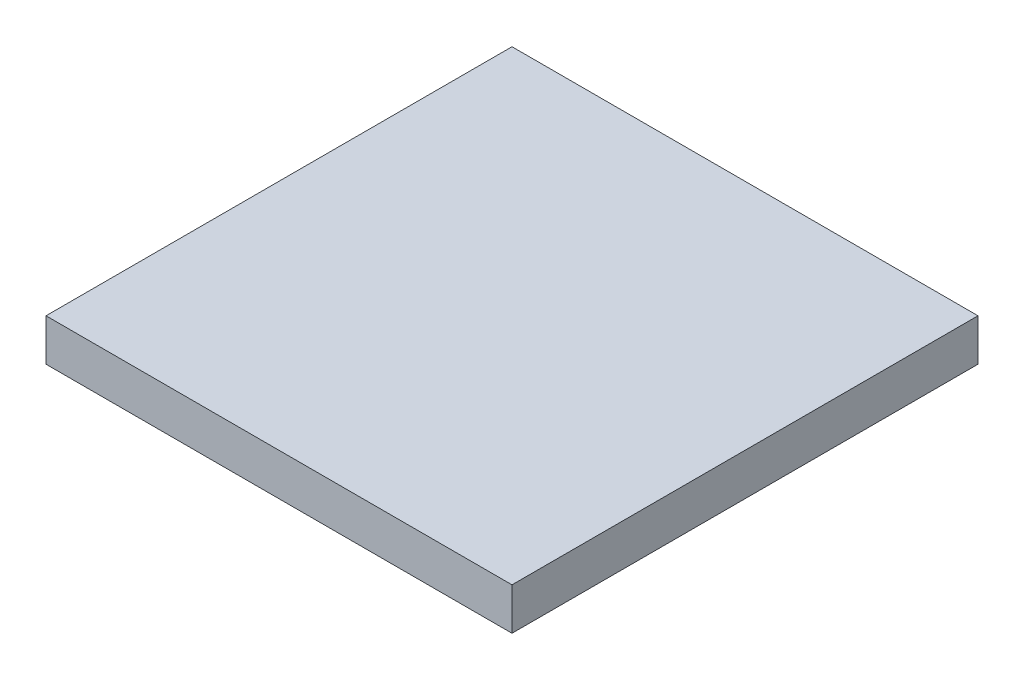
ISO-10303-21;
HEADER;
FILE_DESCRIPTION(('STEP AP214'),'2;1');
FILE_NAME('part.step','',(''),(''),'','','');
FILE_SCHEMA(('AUTOMOTIVE_DESIGN { 1 0 10303 214 1 1 1 1 }'));
ENDSEC;
DATA;
#1=APPLICATION_CONTEXT('core data for automotive mechanical design processes');
#2=APPLICATION_PROTOCOL_DEFINITION('international standard','automotive_design',2000,#1);
#3=PRODUCT_CONTEXT('',#1,'mechanical');
#4=PRODUCT('Part','Part','',(#3));
#5=PRODUCT_RELATED_PRODUCT_CATEGORY('part','',(#4));
#6=PRODUCT_DEFINITION_FORMATION('','',#4);
#7=PRODUCT_DEFINITION_CONTEXT('part definition',#1,'design');
#8=PRODUCT_DEFINITION('design','',#6,#7);
#9=PRODUCT_DEFINITION_SHAPE('','',#8);
#10=(LENGTH_UNIT() NAMED_UNIT(*) SI_UNIT(.MILLI.,.METRE.));
#11=(NAMED_UNIT(*) PLANE_ANGLE_UNIT() SI_UNIT($,.RADIAN.));
#12=(NAMED_UNIT(*) SI_UNIT($,.STERADIAN.) SOLID_ANGLE_UNIT());
#13=UNCERTAINTY_MEASURE_WITH_UNIT(LENGTH_MEASURE(1.E-05),#10,'distance_accuracy_value','');
#14=(GEOMETRIC_REPRESENTATION_CONTEXT(3) GLOBAL_UNCERTAINTY_ASSIGNED_CONTEXT((#13)) GLOBAL_UNIT_ASSIGNED_CONTEXT((#10,
#11,#12)) REPRESENTATION_CONTEXT('',''));
#15=CARTESIAN_POINT('',(0.,0.,0.));
#16=DIRECTION('',(0.,0.,1.));
#17=DIRECTION('',(1.,0.,0.));
#18=AXIS2_PLACEMENT_3D('',#15,#16,#17);
#19=CARTESIAN_POINT('',(0.,1.27,0.));
#20=DIRECTION('',(1.,0.,0.));
#21=DIRECTION('',(0.,0.,-1.));
#22=AXIS2_PLACEMENT_3D('',#19,#20,#21);
#23=PLANE('',#22);
#24=DIRECTION('',(0.,0.,1.));
#25=VECTOR('',#24,1.);
#26=CARTESIAN_POINT('',(0.,0.,0.));
#27=LINE('',#26,#25);
#28=CARTESIAN_POINT('',(0.,0.,-14.1));
#29=VERTEX_POINT('',#28);
#30=CARTESIAN_POINT('',(0.,0.,0.));
#31=VERTEX_POINT('',#30);
#32=EDGE_CURVE('E96',#29,#31,#27,.T.);
#33=ORIENTED_EDGE('',*,*,#32,.T.);
#34=DIRECTION('',(0.,-1.,0.));
#35=VECTOR('',#34,1.);
#36=CARTESIAN_POINT('',(0.,1.27,0.));
#37=LINE('',#36,#35);
#38=CARTESIAN_POINT('',(0.,1.27,0.));
#39=VERTEX_POINT('',#38);
#40=EDGE_CURVE('E11',#39,#31,#37,.T.);
#41=ORIENTED_EDGE('',*,*,#40,.F.);
#42=DIRECTION('',(0.,0.,1.));
#43=VECTOR('',#42,1.);
#44=CARTESIAN_POINT('',(0.,1.27,0.));
#45=LINE('',#44,#43);
#46=CARTESIAN_POINT('',(0.,1.27,-14.1));
#47=VERTEX_POINT('',#46);
#48=EDGE_CURVE('E84',#47,#39,#45,.T.);
#49=ORIENTED_EDGE('',*,*,#48,.F.);
#50=DIRECTION('',(0.,-1.,0.));
#51=VECTOR('',#50,1.);
#52=CARTESIAN_POINT('',(0.,1.27,-14.1));
#53=LINE('',#52,#51);
#54=EDGE_CURVE('E92',#47,#29,#53,.T.);
#55=ORIENTED_EDGE('',*,*,#54,.T.);
#56=EDGE_LOOP('',(#33,#41,#49,#55));
#57=FACE_BOUND('',#56,.T.);
#58=ADVANCED_FACE('F33',(#57),#23,.F.);
#59=CARTESIAN_POINT('',(0.,1.27,0.));
#60=DIRECTION('',(0.,0.,-1.));
#61=DIRECTION('',(-1.,0.,0.));
#62=AXIS2_PLACEMENT_3D('',#59,#60,#61);
#63=PLANE('',#62);
#64=DIRECTION('',(1.,0.,0.));
#65=VECTOR('',#64,1.);
#66=CARTESIAN_POINT('',(0.,0.,0.));
#67=LINE('',#66,#65);
#68=CARTESIAN_POINT('',(14.1,0.,0.));
#69=VERTEX_POINT('',#68);
#70=EDGE_CURVE('E88',#31,#69,#67,.T.);
#71=ORIENTED_EDGE('',*,*,#70,.T.);
#72=DIRECTION('',(0.,-1.,0.));
#73=VECTOR('',#72,1.);
#74=CARTESIAN_POINT('',(14.1,1.27,0.));
#75=LINE('',#74,#73);
#76=CARTESIAN_POINT('',(14.1,1.27,0.));
#77=VERTEX_POINT('',#76);
#78=EDGE_CURVE('E41',#77,#69,#75,.T.);
#79=ORIENTED_EDGE('',*,*,#78,.F.);
#80=DIRECTION('',(1.,0.,0.));
#81=VECTOR('',#80,1.);
#82=CARTESIAN_POINT('',(0.,1.27,0.));
#83=LINE('',#82,#81);
#84=EDGE_CURVE('E79',#39,#77,#83,.T.);
#85=ORIENTED_EDGE('',*,*,#84,.F.);
#86=ORIENTED_EDGE('',*,*,#40,.T.);
#87=EDGE_LOOP('',(#71,#79,#85,#86));
#88=FACE_BOUND('',#87,.T.);
#89=ADVANCED_FACE('F87',(#88),#63,.F.);
#90=CARTESIAN_POINT('',(14.1,1.27,0.));
#91=DIRECTION('',(-1.,0.,0.));
#92=DIRECTION('',(0.,0.,1.));
#93=AXIS2_PLACEMENT_3D('',#90,#91,#92);
#94=PLANE('',#93);
#95=DIRECTION('',(0.,0.,-1.));
#96=VECTOR('',#95,1.);
#97=CARTESIAN_POINT('',(14.1,0.,0.));
#98=LINE('',#97,#96);
#99=CARTESIAN_POINT('',(14.1,0.,-14.1));
#100=VERTEX_POINT('',#99);
#101=EDGE_CURVE('E66',#69,#100,#98,.T.);
#102=ORIENTED_EDGE('',*,*,#101,.T.);
#103=DIRECTION('',(0.,-1.,0.));
#104=VECTOR('',#103,1.);
#105=CARTESIAN_POINT('',(14.1,1.27,-14.1));
#106=LINE('',#105,#104);
#107=CARTESIAN_POINT('',(14.1,1.27,-14.1));
#108=VERTEX_POINT('',#107);
#109=EDGE_CURVE('E89',#108,#100,#106,.T.);
#110=ORIENTED_EDGE('',*,*,#109,.F.);
#111=DIRECTION('',(0.,0.,-1.));
#112=VECTOR('',#111,1.);
#113=CARTESIAN_POINT('',(14.1,1.27,0.));
#114=LINE('',#113,#112);
#115=EDGE_CURVE('E82',#77,#108,#114,.T.);
#116=ORIENTED_EDGE('',*,*,#115,.F.);
#117=ORIENTED_EDGE('',*,*,#78,.T.);
#118=EDGE_LOOP('',(#102,#110,#116,#117));
#119=FACE_BOUND('',#118,.T.);
#120=ADVANCED_FACE('F90',(#119),#94,.F.);
#121=CARTESIAN_POINT('',(0.,1.27,-14.1));
#122=DIRECTION('',(0.,0.,1.));
#123=DIRECTION('',(1.,0.,0.));
#124=AXIS2_PLACEMENT_3D('',#121,#122,#123);
#125=PLANE('',#124);
#126=DIRECTION('',(-1.,0.,0.));
#127=VECTOR('',#126,1.);
#128=CARTESIAN_POINT('',(0.,0.,-14.1));
#129=LINE('',#128,#127);
#130=EDGE_CURVE('E72',#100,#29,#129,.T.);
#131=ORIENTED_EDGE('',*,*,#130,.T.);
#132=ORIENTED_EDGE('',*,*,#54,.F.);
#133=DIRECTION('',(-1.,0.,0.));
#134=VECTOR('',#133,1.);
#135=CARTESIAN_POINT('',(0.,1.27,-14.1));
#136=LINE('',#135,#134);
#137=EDGE_CURVE('E49',#108,#47,#136,.T.);
#138=ORIENTED_EDGE('',*,*,#137,.F.);
#139=ORIENTED_EDGE('',*,*,#109,.T.);
#140=EDGE_LOOP('',(#131,#132,#138,#139));
#141=FACE_BOUND('',#140,.T.);
#142=ADVANCED_FACE('F103',(#141),#125,.F.);
#143=CARTESIAN_POINT('',(0.,1.27,-14.1));
#144=DIRECTION('',(0.,-1.,0.));
#145=DIRECTION('',(0.,0.,-1.));
#146=AXIS2_PLACEMENT_3D('',#143,#144,#145);
#147=PLANE('',#146);
#148=ORIENTED_EDGE('',*,*,#48,.T.);
#149=ORIENTED_EDGE('',*,*,#84,.T.);
#150=ORIENTED_EDGE('',*,*,#115,.T.);
#151=ORIENTED_EDGE('',*,*,#137,.T.);
#152=EDGE_LOOP('',(#148,#149,#150,#151));
#153=FACE_BOUND('',#152,.T.);
#154=ADVANCED_FACE('F80',(#153),#147,.F.);
#155=CARTESIAN_POINT('',(0.,0.,-14.1));
#156=DIRECTION('',(0.,-1.,0.));
#157=DIRECTION('',(0.,0.,-1.));
#158=AXIS2_PLACEMENT_3D('',#155,#156,#157);
#159=PLANE('',#158);
#160=ORIENTED_EDGE('',*,*,#32,.F.);
#161=ORIENTED_EDGE('',*,*,#130,.F.);
#162=ORIENTED_EDGE('',*,*,#101,.F.);
#163=ORIENTED_EDGE('',*,*,#70,.F.);
#164=EDGE_LOOP('',(#160,#161,#162,#163));
#165=FACE_BOUND('',#164,.T.);
#166=ADVANCED_FACE('F106',(#165),#159,.T.);
#167=CLOSED_SHELL('',(#58,#89,#120,#142,#154,#166));
#168=MANIFOLD_SOLID_BREP('B2',#167);
#169=ADVANCED_BREP_SHAPE_REPRESENTATION('',(#18,#168),#14);
#170=SHAPE_DEFINITION_REPRESENTATION(#9,#169);
ENDSEC;
END-ISO-10303-21;
